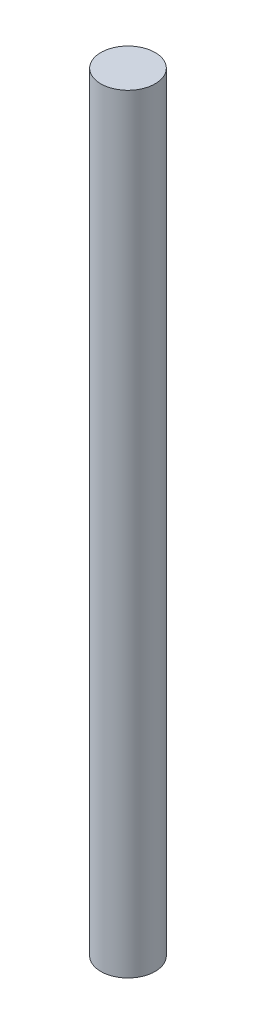
ISO-10303-21;
HEADER;
FILE_DESCRIPTION(('STEP AP214'),'2;1');
FILE_NAME('part.step','',(''),(''),'','','');
FILE_SCHEMA(('AUTOMOTIVE_DESIGN { 1 0 10303 214 1 1 1 1 }'));
ENDSEC;
DATA;
#1=APPLICATION_CONTEXT('core data for automotive mechanical design processes');
#2=APPLICATION_PROTOCOL_DEFINITION('international standard','automotive_design',2000,#1);
#3=PRODUCT_CONTEXT('',#1,'mechanical');
#4=PRODUCT('Part','Part','',(#3));
#5=PRODUCT_RELATED_PRODUCT_CATEGORY('part','',(#4));
#6=PRODUCT_DEFINITION_FORMATION('','',#4);
#7=PRODUCT_DEFINITION_CONTEXT('part definition',#1,'design');
#8=PRODUCT_DEFINITION('design','',#6,#7);
#9=PRODUCT_DEFINITION_SHAPE('','',#8);
#10=(LENGTH_UNIT() NAMED_UNIT(*) SI_UNIT(.MILLI.,.METRE.));
#11=(NAMED_UNIT(*) PLANE_ANGLE_UNIT() SI_UNIT($,.RADIAN.));
#12=(NAMED_UNIT(*) SI_UNIT($,.STERADIAN.) SOLID_ANGLE_UNIT());
#13=UNCERTAINTY_MEASURE_WITH_UNIT(LENGTH_MEASURE(1.E-05),#10,'distance_accuracy_value','');
#14=(GEOMETRIC_REPRESENTATION_CONTEXT(3) GLOBAL_UNCERTAINTY_ASSIGNED_CONTEXT((#13)) GLOBAL_UNIT_ASSIGNED_CONTEXT((#10,
#11,#12)) REPRESENTATION_CONTEXT('',''));
#15=CARTESIAN_POINT('',(0.,0.,0.));
#16=DIRECTION('',(0.,0.,1.));
#17=DIRECTION('',(1.,0.,0.));
#18=AXIS2_PLACEMENT_3D('',#15,#16,#17);
#19=CARTESIAN_POINT('',(0.,170.,0.));
#20=DIRECTION('',(0.,-1.,0.));
#21=DIRECTION('',(0.,0.,-1.));
#22=AXIS2_PLACEMENT_3D('',#19,#20,#21);
#23=CYLINDRICAL_SURFACE('',#22,6.);
#24=CARTESIAN_POINT('',(0.,170.,0.));
#25=DIRECTION('',(0.,1.,0.));
#26=DIRECTION('',(0.,0.,1.));
#27=AXIS2_PLACEMENT_3D('',#24,#25,#26);
#28=CIRCLE('',#27,6.);
#29=CARTESIAN_POINT('',(0.,170.,6.));
#30=VERTEX_POINT('',#29);
#31=EDGE_CURVE('E10',#30,#30,#28,.T.);
#32=ORIENTED_EDGE('',*,*,#31,.F.);
#33=EDGE_LOOP('',(#32));
#34=FACE_BOUND('',#33,.T.);
#35=CARTESIAN_POINT('',(0.,0.,0.));
#36=DIRECTION('',(0.,1.,0.));
#37=DIRECTION('',(0.,0.,1.));
#38=AXIS2_PLACEMENT_3D('',#35,#36,#37);
#39=CIRCLE('',#38,6.);
#40=CARTESIAN_POINT('',(0.,0.,6.));
#41=VERTEX_POINT('',#40);
#42=EDGE_CURVE('E46',#41,#41,#39,.T.);
#43=ORIENTED_EDGE('',*,*,#42,.T.);
#44=EDGE_LOOP('',(#43));
#45=FACE_BOUND('',#44,.T.);
#46=ADVANCED_FACE('F43',(#34,#45),#23,.T.);
#47=CARTESIAN_POINT('',(0.,170.,0.));
#48=DIRECTION('',(0.,1.,0.));
#49=DIRECTION('',(0.,0.,1.));
#50=AXIS2_PLACEMENT_3D('',#47,#48,#49);
#51=PLANE('',#50);
#52=ORIENTED_EDGE('',*,*,#31,.T.);
#53=EDGE_LOOP('',(#52));
#54=FACE_BOUND('',#53,.T.);
#55=ADVANCED_FACE('F60',(#54),#51,.T.);
#56=CARTESIAN_POINT('',(0.,0.,0.));
#57=DIRECTION('',(0.,1.,0.));
#58=DIRECTION('',(0.,0.,1.));
#59=AXIS2_PLACEMENT_3D('',#56,#57,#58);
#60=PLANE('',#59);
#61=ORIENTED_EDGE('',*,*,#42,.F.);
#62=EDGE_LOOP('',(#61));
#63=FACE_BOUND('',#62,.T.);
#64=ADVANCED_FACE('F58',(#63),#60,.F.);
#65=CLOSED_SHELL('',(#46,#55,#64));
#66=MANIFOLD_SOLID_BREP('B2',#65);
#67=ADVANCED_BREP_SHAPE_REPRESENTATION('',(#18,#66),#14);
#68=SHAPE_DEFINITION_REPRESENTATION(#9,#67);
ENDSEC;
END-ISO-10303-21;
